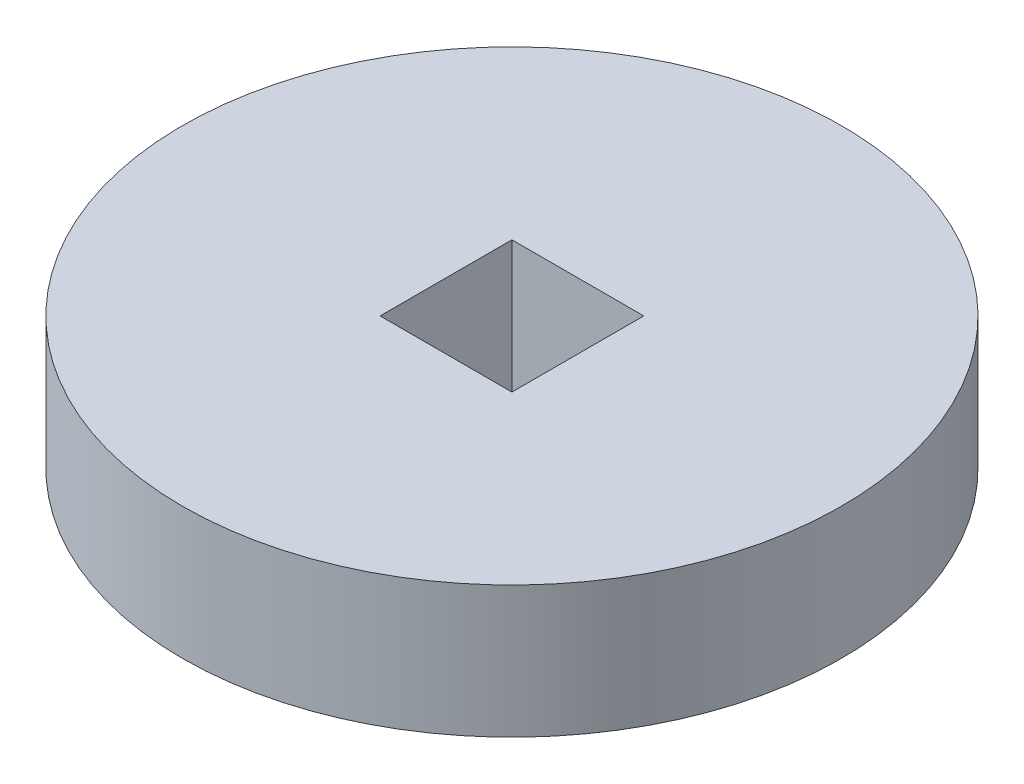
ISO-10303-21;
HEADER;
FILE_DESCRIPTION(('STEP AP214'),'2;1');
FILE_NAME('part.step','',(''),(''),'','','');
FILE_SCHEMA(('AUTOMOTIVE_DESIGN { 1 0 10303 214 1 1 1 1 }'));
ENDSEC;
DATA;
#1=APPLICATION_CONTEXT('core data for automotive mechanical design processes');
#2=APPLICATION_PROTOCOL_DEFINITION('international standard','automotive_design',2000,#1);
#3=PRODUCT_CONTEXT('',#1,'mechanical');
#4=PRODUCT('Part','Part','',(#3));
#5=PRODUCT_RELATED_PRODUCT_CATEGORY('part','',(#4));
#6=PRODUCT_DEFINITION_FORMATION('','',#4);
#7=PRODUCT_DEFINITION_CONTEXT('part definition',#1,'design');
#8=PRODUCT_DEFINITION('design','',#6,#7);
#9=PRODUCT_DEFINITION_SHAPE('','',#8);
#10=(LENGTH_UNIT() NAMED_UNIT(*) SI_UNIT(.MILLI.,.METRE.));
#11=(NAMED_UNIT(*) PLANE_ANGLE_UNIT() SI_UNIT($,.RADIAN.));
#12=(NAMED_UNIT(*) SI_UNIT($,.STERADIAN.) SOLID_ANGLE_UNIT());
#13=UNCERTAINTY_MEASURE_WITH_UNIT(LENGTH_MEASURE(1.E-05),#10,'distance_accuracy_value','');
#14=(GEOMETRIC_REPRESENTATION_CONTEXT(3) GLOBAL_UNCERTAINTY_ASSIGNED_CONTEXT((#13)) GLOBAL_UNIT_ASSIGNED_CONTEXT((#10,
#11,#12)) REPRESENTATION_CONTEXT('',''));
#15=CARTESIAN_POINT('',(0.,0.,0.));
#16=DIRECTION('',(0.,0.,1.));
#17=DIRECTION('',(1.,0.,0.));
#18=AXIS2_PLACEMENT_3D('',#15,#16,#17);
#19=CARTESIAN_POINT('',(0.,6.35,0.));
#20=DIRECTION('',(0.,1.,0.));
#21=DIRECTION('',(0.,0.,1.));
#22=AXIS2_PLACEMENT_3D('',#19,#20,#21);
#23=PLANE('',#22);
#24=CARTESIAN_POINT('',(0.,6.35,0.));
#25=DIRECTION('',(0.,1.,0.));
#26=DIRECTION('',(0.,0.,1.));
#27=AXIS2_PLACEMENT_3D('',#24,#25,#26);
#28=CIRCLE('',#27,15.875);
#29=CARTESIAN_POINT('',(0.,6.35,15.875));
#30=VERTEX_POINT('',#29);
#31=EDGE_CURVE('E11',#30,#30,#28,.T.);
#32=ORIENTED_EDGE('',*,*,#31,.T.);
#33=EDGE_LOOP('',(#32));
#34=FACE_BOUND('',#33,.T.);
#35=DIRECTION('',(-1.,0.,0.));
#36=VECTOR('',#35,1.);
#37=CARTESIAN_POINT('',(-3.175,6.35,-3.175));
#38=LINE('',#37,#36);
#39=CARTESIAN_POINT('',(3.175,6.35,-3.175));
#40=VERTEX_POINT('',#39);
#41=CARTESIAN_POINT('',(-3.175,6.35,-3.175));
#42=VERTEX_POINT('',#41);
#43=EDGE_CURVE('E82',#40,#42,#38,.T.);
#44=ORIENTED_EDGE('',*,*,#43,.F.);
#45=DIRECTION('',(0.,0.,-1.));
#46=VECTOR('',#45,1.);
#47=CARTESIAN_POINT('',(3.175,6.35,-3.175));
#48=LINE('',#47,#46);
#49=CARTESIAN_POINT('',(3.175,6.35,3.175));
#50=VERTEX_POINT('',#49);
#51=EDGE_CURVE('E74',#50,#40,#48,.T.);
#52=ORIENTED_EDGE('',*,*,#51,.F.);
#53=DIRECTION('',(1.,0.,0.));
#54=VECTOR('',#53,1.);
#55=CARTESIAN_POINT('',(-3.175,6.35,3.175));
#56=LINE('',#55,#54);
#57=CARTESIAN_POINT('',(-3.175,6.35,3.175));
#58=VERTEX_POINT('',#57);
#59=EDGE_CURVE('E95',#58,#50,#56,.T.);
#60=ORIENTED_EDGE('',*,*,#59,.F.);
#61=DIRECTION('',(0.,0.,1.));
#62=VECTOR('',#61,1.);
#63=CARTESIAN_POINT('',(-3.175,6.35,-3.175));
#64=LINE('',#63,#62);
#65=EDGE_CURVE('E93',#42,#58,#64,.T.);
#66=ORIENTED_EDGE('',*,*,#65,.F.);
#67=EDGE_LOOP('',(#44,#52,#60,#66));
#68=FACE_BOUND('',#67,.T.);
#69=ADVANCED_FACE('F33',(#34,#68),#23,.T.);
#70=CARTESIAN_POINT('',(0.,0.,0.));
#71=DIRECTION('',(0.,1.,0.));
#72=DIRECTION('',(0.,0.,1.));
#73=AXIS2_PLACEMENT_3D('',#70,#71,#72);
#74=PLANE('',#73);
#75=CARTESIAN_POINT('',(0.,0.,0.));
#76=DIRECTION('',(0.,1.,0.));
#77=DIRECTION('',(0.,0.,1.));
#78=AXIS2_PLACEMENT_3D('',#75,#76,#77);
#79=CIRCLE('',#78,15.875);
#80=CARTESIAN_POINT('',(0.,0.,15.875));
#81=VERTEX_POINT('',#80);
#82=EDGE_CURVE('E37',#81,#81,#79,.T.);
#83=ORIENTED_EDGE('',*,*,#82,.F.);
#84=EDGE_LOOP('',(#83));
#85=FACE_BOUND('',#84,.T.);
#86=DIRECTION('',(0.,0.,-1.));
#87=VECTOR('',#86,1.);
#88=CARTESIAN_POINT('',(3.175,0.,-3.175));
#89=LINE('',#88,#87);
#90=CARTESIAN_POINT('',(3.175,0.,3.175));
#91=VERTEX_POINT('',#90);
#92=CARTESIAN_POINT('',(3.175,0.,-3.175));
#93=VERTEX_POINT('',#92);
#94=EDGE_CURVE('E56',#91,#93,#89,.T.);
#95=ORIENTED_EDGE('',*,*,#94,.T.);
#96=DIRECTION('',(-1.,0.,0.));
#97=VECTOR('',#96,1.);
#98=CARTESIAN_POINT('',(-3.175,0.,-3.175));
#99=LINE('',#98,#97);
#100=CARTESIAN_POINT('',(-3.175,0.,-3.175));
#101=VERTEX_POINT('',#100);
#102=EDGE_CURVE('E89',#93,#101,#99,.T.);
#103=ORIENTED_EDGE('',*,*,#102,.T.);
#104=DIRECTION('',(0.,0.,1.));
#105=VECTOR('',#104,1.);
#106=CARTESIAN_POINT('',(-3.175,0.,-3.175));
#107=LINE('',#106,#105);
#108=CARTESIAN_POINT('',(-3.175,0.,3.175));
#109=VERTEX_POINT('',#108);
#110=EDGE_CURVE('E101',#101,#109,#107,.T.);
#111=ORIENTED_EDGE('',*,*,#110,.T.);
#112=DIRECTION('',(1.,0.,0.));
#113=VECTOR('',#112,1.);
#114=CARTESIAN_POINT('',(-3.175,0.,3.175));
#115=LINE('',#114,#113);
#116=EDGE_CURVE('E83',#109,#91,#115,.T.);
#117=ORIENTED_EDGE('',*,*,#116,.T.);
#118=EDGE_LOOP('',(#95,#103,#111,#117));
#119=FACE_BOUND('',#118,.T.);
#120=ADVANCED_FACE('F112',(#85,#119),#74,.F.);
#121=CARTESIAN_POINT('',(0.,6.35,0.));
#122=DIRECTION('',(0.,-1.,0.));
#123=DIRECTION('',(0.,0.,-1.));
#124=AXIS2_PLACEMENT_3D('',#121,#122,#123);
#125=CYLINDRICAL_SURFACE('',#124,15.875);
#126=ORIENTED_EDGE('',*,*,#31,.F.);
#127=EDGE_LOOP('',(#126));
#128=FACE_BOUND('',#127,.T.);
#129=ORIENTED_EDGE('',*,*,#82,.T.);
#130=EDGE_LOOP('',(#129));
#131=FACE_BOUND('',#130,.T.);
#132=ADVANCED_FACE('F35',(#128,#131),#125,.T.);
#133=CARTESIAN_POINT('',(3.175,6.35,-3.175));
#134=DIRECTION('',(-1.,0.,0.));
#135=DIRECTION('',(0.,0.,1.));
#136=AXIS2_PLACEMENT_3D('',#133,#134,#135);
#137=PLANE('',#136);
#138=ORIENTED_EDGE('',*,*,#94,.F.);
#139=DIRECTION('',(0.,-1.,0.));
#140=VECTOR('',#139,1.);
#141=CARTESIAN_POINT('',(3.175,6.35,3.175));
#142=LINE('',#141,#140);
#143=EDGE_CURVE('E78',#50,#91,#142,.T.);
#144=ORIENTED_EDGE('',*,*,#143,.F.);
#145=ORIENTED_EDGE('',*,*,#51,.T.);
#146=DIRECTION('',(0.,-1.,0.));
#147=VECTOR('',#146,1.);
#148=CARTESIAN_POINT('',(3.175,6.35,-3.175));
#149=LINE('',#148,#147);
#150=EDGE_CURVE('E77',#40,#93,#149,.T.);
#151=ORIENTED_EDGE('',*,*,#150,.T.);
#152=EDGE_LOOP('',(#138,#144,#145,#151));
#153=FACE_BOUND('',#152,.T.);
#154=ADVANCED_FACE('F76',(#153),#137,.T.);
#155=CARTESIAN_POINT('',(-3.175,6.35,-3.175));
#156=DIRECTION('',(0.,0.,1.));
#157=DIRECTION('',(1.,0.,0.));
#158=AXIS2_PLACEMENT_3D('',#155,#156,#157);
#159=PLANE('',#158);
#160=ORIENTED_EDGE('',*,*,#102,.F.);
#161=ORIENTED_EDGE('',*,*,#150,.F.);
#162=ORIENTED_EDGE('',*,*,#43,.T.);
#163=DIRECTION('',(0.,-1.,0.));
#164=VECTOR('',#163,1.);
#165=CARTESIAN_POINT('',(-3.175,6.35,-3.175));
#166=LINE('',#165,#164);
#167=EDGE_CURVE('E90',#42,#101,#166,.T.);
#168=ORIENTED_EDGE('',*,*,#167,.T.);
#169=EDGE_LOOP('',(#160,#161,#162,#168));
#170=FACE_BOUND('',#169,.T.);
#171=ADVANCED_FACE('F86',(#170),#159,.T.);
#172=CARTESIAN_POINT('',(-3.175,6.35,-3.175));
#173=DIRECTION('',(1.,0.,0.));
#174=DIRECTION('',(0.,0.,-1.));
#175=AXIS2_PLACEMENT_3D('',#172,#173,#174);
#176=PLANE('',#175);
#177=ORIENTED_EDGE('',*,*,#110,.F.);
#178=ORIENTED_EDGE('',*,*,#167,.F.);
#179=ORIENTED_EDGE('',*,*,#65,.T.);
#180=DIRECTION('',(0.,-1.,0.));
#181=VECTOR('',#180,1.);
#182=CARTESIAN_POINT('',(-3.175,6.35,3.175));
#183=LINE('',#182,#181);
#184=EDGE_CURVE('E48',#58,#109,#183,.T.);
#185=ORIENTED_EDGE('',*,*,#184,.T.);
#186=EDGE_LOOP('',(#177,#178,#179,#185));
#187=FACE_BOUND('',#186,.T.);
#188=ADVANCED_FACE('F110',(#187),#176,.T.);
#189=CARTESIAN_POINT('',(-3.175,6.35,3.175));
#190=DIRECTION('',(0.,0.,-1.));
#191=DIRECTION('',(-1.,0.,0.));
#192=AXIS2_PLACEMENT_3D('',#189,#190,#191);
#193=PLANE('',#192);
#194=ORIENTED_EDGE('',*,*,#116,.F.);
#195=ORIENTED_EDGE('',*,*,#184,.F.);
#196=ORIENTED_EDGE('',*,*,#59,.T.);
#197=ORIENTED_EDGE('',*,*,#143,.T.);
#198=EDGE_LOOP('',(#194,#195,#196,#197));
#199=FACE_BOUND('',#198,.T.);
#200=ADVANCED_FACE('F113',(#199),#193,.T.);
#201=CLOSED_SHELL('',(#69,#120,#132,#154,#171,#188,#200));
#202=MANIFOLD_SOLID_BREP('B2',#201);
#203=ADVANCED_BREP_SHAPE_REPRESENTATION('',(#18,#202),#14);
#204=SHAPE_DEFINITION_REPRESENTATION(#9,#203);
ENDSEC;
END-ISO-10303-21;
